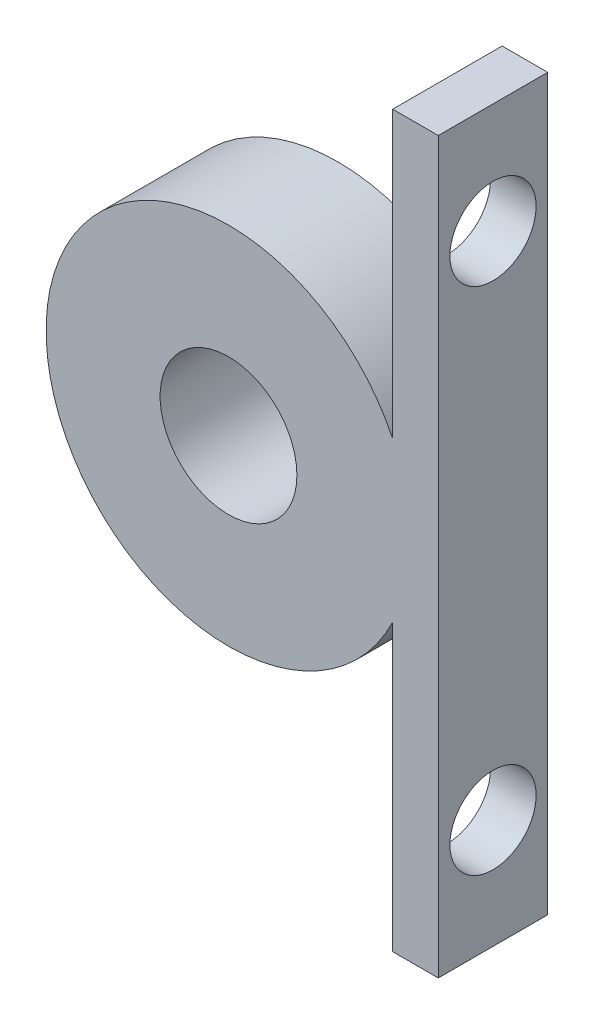
ISO-10303-21;
HEADER;
FILE_DESCRIPTION(('STEP AP214'),'2;1');
FILE_NAME('part.step','',(''),(''),'','','');
FILE_SCHEMA(('AUTOMOTIVE_DESIGN { 1 0 10303 214 1 1 1 1 }'));
ENDSEC;
DATA;
#1=APPLICATION_CONTEXT('core data for automotive mechanical design processes');
#2=APPLICATION_PROTOCOL_DEFINITION('international standard','automotive_design',2000,#1);
#3=PRODUCT_CONTEXT('',#1,'mechanical');
#4=PRODUCT('Part','Part','',(#3));
#5=PRODUCT_RELATED_PRODUCT_CATEGORY('part','',(#4));
#6=PRODUCT_DEFINITION_FORMATION('','',#4);
#7=PRODUCT_DEFINITION_CONTEXT('part definition',#1,'design');
#8=PRODUCT_DEFINITION('design','',#6,#7);
#9=PRODUCT_DEFINITION_SHAPE('','',#8);
#10=(LENGTH_UNIT() NAMED_UNIT(*) SI_UNIT(.MILLI.,.METRE.));
#11=(NAMED_UNIT(*) PLANE_ANGLE_UNIT() SI_UNIT($,.RADIAN.));
#12=(NAMED_UNIT(*) SI_UNIT($,.STERADIAN.) SOLID_ANGLE_UNIT());
#13=UNCERTAINTY_MEASURE_WITH_UNIT(LENGTH_MEASURE(1.E-05),#10,'distance_accuracy_value','');
#14=(GEOMETRIC_REPRESENTATION_CONTEXT(3) GLOBAL_UNCERTAINTY_ASSIGNED_CONTEXT((#13)) GLOBAL_UNIT_ASSIGNED_CONTEXT((#10,
#11,#12)) REPRESENTATION_CONTEXT('',''));
#15=CARTESIAN_POINT('',(0.,0.,0.));
#16=DIRECTION('',(0.,0.,1.));
#17=DIRECTION('',(1.,0.,0.));
#18=AXIS2_PLACEMENT_3D('',#15,#16,#17);
#19=CARTESIAN_POINT('',(0.,-28.0159542257824,7.62));
#20=DIRECTION('',(0.,1.,0.));
#21=DIRECTION('',(0.,0.,1.));
#22=AXIS2_PLACEMENT_3D('',#19,#20,#21);
#23=PLANE('',#22);
#24=DIRECTION('',(1.,0.,0.));
#25=VECTOR('',#24,1.);
#26=CARTESIAN_POINT('',(0.,-28.0159542257824,0.));
#27=LINE('',#26,#25);
#28=CARTESIAN_POINT('',(0.,-28.0159542257824,0.));
#29=VERTEX_POINT('',#28);
#30=CARTESIAN_POINT('',(3.175,-28.0159542257824,0.));
#31=VERTEX_POINT('',#30);
#32=EDGE_CURVE('E133',#29,#31,#27,.T.);
#33=ORIENTED_EDGE('',*,*,#32,.T.);
#34=DIRECTION('',(0.,0.,-1.));
#35=VECTOR('',#34,1.);
#36=CARTESIAN_POINT('',(3.175,-28.0159542257824,7.62));
#37=LINE('',#36,#35);
#38=CARTESIAN_POINT('',(3.175,-28.0159542257824,7.62));
#39=VERTEX_POINT('',#38);
#40=EDGE_CURVE('E11',#39,#31,#37,.T.);
#41=ORIENTED_EDGE('',*,*,#40,.F.);
#42=DIRECTION('',(1.,0.,0.));
#43=VECTOR('',#42,1.);
#44=CARTESIAN_POINT('',(0.,-28.0159542257824,7.62));
#45=LINE('',#44,#43);
#46=CARTESIAN_POINT('',(0.,-28.0159542257824,7.62));
#47=VERTEX_POINT('',#46);
#48=EDGE_CURVE('E147',#47,#39,#45,.T.);
#49=ORIENTED_EDGE('',*,*,#48,.F.);
#50=DIRECTION('',(0.,0.,-1.));
#51=VECTOR('',#50,1.);
#52=CARTESIAN_POINT('',(0.,-28.0159542257824,7.62));
#53=LINE('',#52,#51);
#54=EDGE_CURVE('E132',#47,#29,#53,.T.);
#55=ORIENTED_EDGE('',*,*,#54,.T.);
#56=EDGE_LOOP('',(#33,#41,#49,#55));
#57=FACE_BOUND('',#56,.T.);
#58=ADVANCED_FACE('F43',(#57),#23,.F.);
#59=CARTESIAN_POINT('',(3.175,0.,7.62));
#60=DIRECTION('',(-1.,0.,0.));
#61=DIRECTION('',(0.,-1.,0.));
#62=AXIS2_PLACEMENT_3D('',#59,#60,#61);
#63=PLANE('',#62);
#64=CARTESIAN_POINT('',(3.175,15.1166714258176,3.81));
#65=DIRECTION('',(-1.,0.,0.));
#66=DIRECTION('',(0.,-1.,0.));
#67=AXIS2_PLACEMENT_3D('',#64,#65,#66);
#68=CIRCLE('',#67,3.);
#69=CARTESIAN_POINT('',(3.175,12.1166714258176,3.81));
#70=VERTEX_POINT('',#69);
#71=EDGE_CURVE('E137',#70,#70,#68,.T.);
#72=ORIENTED_EDGE('',*,*,#71,.T.);
#73=EDGE_LOOP('',(#72));
#74=FACE_BOUND('',#73,.T.);
#75=CARTESIAN_POINT('',(3.175,-20.3959542257824,3.80999999999999));
#76=DIRECTION('',(-1.,0.,0.));
#77=DIRECTION('',(0.,-1.,0.));
#78=AXIS2_PLACEMENT_3D('',#75,#76,#77);
#79=CIRCLE('',#78,3.);
#80=CARTESIAN_POINT('',(3.175,-23.3959542257824,3.80999999999999));
#81=VERTEX_POINT('',#80);
#82=EDGE_CURVE('E154',#81,#81,#79,.T.);
#83=ORIENTED_EDGE('',*,*,#82,.T.);
#84=EDGE_LOOP('',(#83));
#85=FACE_BOUND('',#84,.T.);
#86=DIRECTION('',(0.,1.,0.));
#87=VECTOR('',#86,1.);
#88=CARTESIAN_POINT('',(3.175,0.,0.));
#89=LINE('',#88,#87);
#90=CARTESIAN_POINT('',(3.175,22.7840457742176,0.));
#91=VERTEX_POINT('',#90);
#92=EDGE_CURVE('E136',#31,#91,#89,.T.);
#93=ORIENTED_EDGE('',*,*,#92,.T.);
#94=DIRECTION('',(0.,0.,-1.));
#95=VECTOR('',#94,1.);
#96=CARTESIAN_POINT('',(3.175,22.7840457742176,7.62));
#97=LINE('',#96,#95);
#98=CARTESIAN_POINT('',(3.175,22.7840457742176,7.62));
#99=VERTEX_POINT('',#98);
#100=EDGE_CURVE('E52',#99,#91,#97,.T.);
#101=ORIENTED_EDGE('',*,*,#100,.F.);
#102=DIRECTION('',(0.,1.,0.));
#103=VECTOR('',#102,1.);
#104=CARTESIAN_POINT('',(3.175,0.,7.62));
#105=LINE('',#104,#103);
#106=EDGE_CURVE('E98',#39,#99,#105,.T.);
#107=ORIENTED_EDGE('',*,*,#106,.F.);
#108=ORIENTED_EDGE('',*,*,#40,.T.);
#109=EDGE_LOOP('',(#93,#101,#107,#108));
#110=FACE_BOUND('',#109,.T.);
#111=ADVANCED_FACE('F168',(#74,#85,#110),#63,.F.);
#112=CARTESIAN_POINT('',(0.,22.7840457742176,7.62));
#113=DIRECTION('',(0.,-1.,0.));
#114=DIRECTION('',(0.,0.,-1.));
#115=AXIS2_PLACEMENT_3D('',#112,#113,#114);
#116=PLANE('',#115);
#117=DIRECTION('',(-1.,0.,0.));
#118=VECTOR('',#117,1.);
#119=CARTESIAN_POINT('',(0.,22.7840457742176,0.));
#120=LINE('',#119,#118);
#121=CARTESIAN_POINT('',(0.,22.7840457742176,0.));
#122=VERTEX_POINT('',#121);
#123=EDGE_CURVE('E139',#91,#122,#120,.T.);
#124=ORIENTED_EDGE('',*,*,#123,.T.);
#125=DIRECTION('',(0.,0.,-1.));
#126=VECTOR('',#125,1.);
#127=CARTESIAN_POINT('',(0.,22.7840457742176,7.62));
#128=LINE('',#127,#126);
#129=CARTESIAN_POINT('',(0.,22.7840457742176,7.62));
#130=VERTEX_POINT('',#129);
#131=EDGE_CURVE('E121',#130,#122,#128,.T.);
#132=ORIENTED_EDGE('',*,*,#131,.F.);
#133=DIRECTION('',(-1.,0.,0.));
#134=VECTOR('',#133,1.);
#135=CARTESIAN_POINT('',(0.,22.7840457742176,7.62));
#136=LINE('',#135,#134);
#137=EDGE_CURVE('E112',#99,#130,#136,.T.);
#138=ORIENTED_EDGE('',*,*,#137,.F.);
#139=ORIENTED_EDGE('',*,*,#100,.T.);
#140=EDGE_LOOP('',(#124,#132,#138,#139));
#141=FACE_BOUND('',#140,.T.);
#142=ADVANCED_FACE('F171',(#141),#116,.F.);
#143=CARTESIAN_POINT('',(0.,0.,7.62));
#144=DIRECTION('',(1.,0.,0.));
#145=DIRECTION('',(0.,1.,0.));
#146=AXIS2_PLACEMENT_3D('',#143,#144,#145);
#147=PLANE('',#146);
#148=CARTESIAN_POINT('',(0.,15.1166714258176,3.81));
#149=DIRECTION('',(1.,0.,0.));
#150=DIRECTION('',(0.,1.,0.));
#151=AXIS2_PLACEMENT_3D('',#148,#149,#150);
#152=CIRCLE('',#151,3.);
#153=CARTESIAN_POINT('',(0.,18.1166714258176,3.81));
#154=VERTEX_POINT('',#153);
#155=EDGE_CURVE('E46',#154,#154,#152,.T.);
#156=ORIENTED_EDGE('',*,*,#155,.T.);
#157=EDGE_LOOP('',(#156));
#158=FACE_BOUND('',#157,.T.);
#159=DIRECTION('',(0.,-1.,0.));
#160=VECTOR('',#159,1.);
#161=CARTESIAN_POINT('',(0.,0.,0.));
#162=LINE('',#161,#160);
#163=CARTESIAN_POINT('',(0.,2.91984743251426,0.));
#164=VERTEX_POINT('',#163);
#165=EDGE_CURVE('E120',#122,#164,#162,.T.);
#166=ORIENTED_EDGE('',*,*,#165,.T.);
#167=DIRECTION('',(0.,0.,-1.));
#168=VECTOR('',#167,1.);
#169=CARTESIAN_POINT('',(0.,2.91984743251426,7.62));
#170=LINE('',#169,#168);
#171=CARTESIAN_POINT('',(0.,2.91984743251426,7.62));
#172=VERTEX_POINT('',#171);
#173=EDGE_CURVE('E117',#172,#164,#170,.T.);
#174=ORIENTED_EDGE('',*,*,#173,.F.);
#175=DIRECTION('',(0.,-1.,0.));
#176=VECTOR('',#175,1.);
#177=CARTESIAN_POINT('',(0.,0.,7.62));
#178=LINE('',#177,#176);
#179=EDGE_CURVE('E105',#130,#172,#178,.T.);
#180=ORIENTED_EDGE('',*,*,#179,.F.);
#181=ORIENTED_EDGE('',*,*,#131,.T.);
#182=EDGE_LOOP('',(#166,#174,#180,#181));
#183=FACE_BOUND('',#182,.T.);
#184=ADVANCED_FACE('F118',(#158,#183),#147,.F.);
#185=CARTESIAN_POINT('',(-11.43,-2.61595422578239,7.62));
#186=DIRECTION('',(0.,0.,-1.));
#187=DIRECTION('',(-1.,0.,0.));
#188=AXIS2_PLACEMENT_3D('',#185,#186,#187);
#189=CYLINDRICAL_SURFACE('',#188,12.7);
#190=CARTESIAN_POINT('',(-11.43,-2.61595422578239,0.));
#191=DIRECTION('',(0.,0.,1.));
#192=DIRECTION('',(1.,0.,0.));
#193=AXIS2_PLACEMENT_3D('',#190,#191,#192);
#194=CIRCLE('',#193,12.7);
#195=CARTESIAN_POINT('',(0.,-8.15175588407905,0.));
#196=VERTEX_POINT('',#195);
#197=EDGE_CURVE('E84',#164,#196,#194,.T.);
#198=ORIENTED_EDGE('',*,*,#197,.T.);
#199=DIRECTION('',(0.,0.,-1.));
#200=VECTOR('',#199,1.);
#201=CARTESIAN_POINT('',(0.,-8.15175588407905,7.62));
#202=LINE('',#201,#200);
#203=CARTESIAN_POINT('',(0.,-8.15175588407905,7.62));
#204=VERTEX_POINT('',#203);
#205=EDGE_CURVE('E122',#204,#196,#202,.T.);
#206=ORIENTED_EDGE('',*,*,#205,.F.);
#207=CARTESIAN_POINT('',(-11.43,-2.61595422578239,7.62));
#208=DIRECTION('',(0.,0.,1.));
#209=DIRECTION('',(1.,0.,0.));
#210=AXIS2_PLACEMENT_3D('',#207,#208,#209);
#211=CIRCLE('',#210,12.7);
#212=EDGE_CURVE('E110',#172,#204,#211,.T.);
#213=ORIENTED_EDGE('',*,*,#212,.F.);
#214=ORIENTED_EDGE('',*,*,#173,.T.);
#215=EDGE_LOOP('',(#198,#206,#213,#214));
#216=FACE_BOUND('',#215,.T.);
#217=ADVANCED_FACE('F124',(#216),#189,.T.);
#218=CARTESIAN_POINT('',(0.,0.,7.62));
#219=DIRECTION('',(1.,0.,0.));
#220=DIRECTION('',(0.,1.,0.));
#221=AXIS2_PLACEMENT_3D('',#218,#219,#220);
#222=PLANE('',#221);
#223=CARTESIAN_POINT('',(0.,-20.3959542257824,3.80999999999999));
#224=DIRECTION('',(1.,0.,0.));
#225=DIRECTION('',(0.,1.,0.));
#226=AXIS2_PLACEMENT_3D('',#223,#224,#225);
#227=CIRCLE('',#226,3.);
#228=CARTESIAN_POINT('',(0.,-17.3959542257824,3.80999999999999));
#229=VERTEX_POINT('',#228);
#230=EDGE_CURVE('E152',#229,#229,#227,.T.);
#231=ORIENTED_EDGE('',*,*,#230,.T.);
#232=EDGE_LOOP('',(#231));
#233=FACE_BOUND('',#232,.T.);
#234=DIRECTION('',(0.,-1.,0.));
#235=VECTOR('',#234,1.);
#236=CARTESIAN_POINT('',(0.,0.,0.));
#237=LINE('',#236,#235);
#238=EDGE_CURVE('E90',#196,#29,#237,.T.);
#239=ORIENTED_EDGE('',*,*,#238,.T.);
#240=ORIENTED_EDGE('',*,*,#54,.F.);
#241=DIRECTION('',(0.,-1.,0.));
#242=VECTOR('',#241,1.);
#243=CARTESIAN_POINT('',(0.,0.,7.62));
#244=LINE('',#243,#242);
#245=EDGE_CURVE('E61',#204,#47,#244,.T.);
#246=ORIENTED_EDGE('',*,*,#245,.F.);
#247=ORIENTED_EDGE('',*,*,#205,.T.);
#248=EDGE_LOOP('',(#239,#240,#246,#247));
#249=FACE_BOUND('',#248,.T.);
#250=ADVANCED_FACE('F177',(#233,#249),#222,.F.);
#251=CARTESIAN_POINT('',(-11.43,-2.61595422578239,7.62));
#252=DIRECTION('',(0.,0.,-1.));
#253=DIRECTION('',(-1.,0.,0.));
#254=AXIS2_PLACEMENT_3D('',#251,#252,#253);
#255=CYLINDRICAL_SURFACE('',#254,4.7625);
#256=CARTESIAN_POINT('',(-11.43,-2.61595422578239,7.62));
#257=DIRECTION('',(0.,0.,1.));
#258=DIRECTION('',(1.,0.,0.));
#259=AXIS2_PLACEMENT_3D('',#256,#257,#258);
#260=CIRCLE('',#259,4.7625);
#261=CARTESIAN_POINT('',(-6.6675,-2.61595422578239,7.62));
#262=VERTEX_POINT('',#261);
#263=EDGE_CURVE('E126',#262,#262,#260,.T.);
#264=ORIENTED_EDGE('',*,*,#263,.T.);
#265=EDGE_LOOP('',(#264));
#266=FACE_BOUND('',#265,.T.);
#267=CARTESIAN_POINT('',(-11.43,-2.61595422578239,0.));
#268=DIRECTION('',(0.,0.,1.));
#269=DIRECTION('',(1.,0.,0.));
#270=AXIS2_PLACEMENT_3D('',#267,#268,#269);
#271=CIRCLE('',#270,4.7625);
#272=CARTESIAN_POINT('',(-6.6675,-2.61595422578239,0.));
#273=VERTEX_POINT('',#272);
#274=EDGE_CURVE('E144',#273,#273,#271,.T.);
#275=ORIENTED_EDGE('',*,*,#274,.F.);
#276=EDGE_LOOP('',(#275));
#277=FACE_BOUND('',#276,.T.);
#278=ADVANCED_FACE('F179',(#266,#277),#255,.F.);
#279=CARTESIAN_POINT('',(0.,0.,7.62));
#280=DIRECTION('',(0.,0.,1.));
#281=DIRECTION('',(1.,0.,0.));
#282=AXIS2_PLACEMENT_3D('',#279,#280,#281);
#283=PLANE('',#282);
#284=ORIENTED_EDGE('',*,*,#48,.T.);
#285=ORIENTED_EDGE('',*,*,#106,.T.);
#286=ORIENTED_EDGE('',*,*,#137,.T.);
#287=ORIENTED_EDGE('',*,*,#179,.T.);
#288=ORIENTED_EDGE('',*,*,#212,.T.);
#289=ORIENTED_EDGE('',*,*,#245,.T.);
#290=EDGE_LOOP('',(#284,#285,#286,#287,#288,#289));
#291=FACE_BOUND('',#290,.T.);
#292=ORIENTED_EDGE('',*,*,#263,.F.);
#293=EDGE_LOOP('',(#292));
#294=FACE_BOUND('',#293,.T.);
#295=ADVANCED_FACE('F107',(#291,#294),#283,.T.);
#296=CARTESIAN_POINT('',(0.,0.,0.));
#297=DIRECTION('',(0.,0.,1.));
#298=DIRECTION('',(1.,0.,0.));
#299=AXIS2_PLACEMENT_3D('',#296,#297,#298);
#300=PLANE('',#299);
#301=ORIENTED_EDGE('',*,*,#32,.F.);
#302=ORIENTED_EDGE('',*,*,#238,.F.);
#303=ORIENTED_EDGE('',*,*,#197,.F.);
#304=ORIENTED_EDGE('',*,*,#165,.F.);
#305=ORIENTED_EDGE('',*,*,#123,.F.);
#306=ORIENTED_EDGE('',*,*,#92,.F.);
#307=EDGE_LOOP('',(#301,#302,#303,#304,#305,#306));
#308=FACE_BOUND('',#307,.T.);
#309=ORIENTED_EDGE('',*,*,#274,.T.);
#310=EDGE_LOOP('',(#309));
#311=FACE_BOUND('',#310,.T.);
#312=ADVANCED_FACE('F174',(#308,#311),#300,.F.);
#313=CARTESIAN_POINT('',(-1.905,-20.3959542257824,3.80999999999999));
#314=DIRECTION('',(1.,0.,0.));
#315=DIRECTION('',(0.,1.,0.));
#316=AXIS2_PLACEMENT_3D('',#313,#314,#315);
#317=CYLINDRICAL_SURFACE('',#316,3.);
#318=ORIENTED_EDGE('',*,*,#230,.F.);
#319=EDGE_LOOP('',(#318));
#320=FACE_BOUND('',#319,.T.);
#321=ORIENTED_EDGE('',*,*,#82,.F.);
#322=EDGE_LOOP('',(#321));
#323=FACE_BOUND('',#322,.T.);
#324=ADVANCED_FACE('F209',(#320,#323),#317,.F.);
#325=CARTESIAN_POINT('',(-1.905,15.1166714258176,3.81));
#326=DIRECTION('',(1.,0.,0.));
#327=DIRECTION('',(0.,1.,0.));
#328=AXIS2_PLACEMENT_3D('',#325,#326,#327);
#329=CYLINDRICAL_SURFACE('',#328,3.);
#330=ORIENTED_EDGE('',*,*,#155,.F.);
#331=EDGE_LOOP('',(#330));
#332=FACE_BOUND('',#331,.T.);
#333=ORIENTED_EDGE('',*,*,#71,.F.);
#334=EDGE_LOOP('',(#333));
#335=FACE_BOUND('',#334,.T.);
#336=ADVANCED_FACE('F206',(#332,#335),#329,.F.);
#337=CLOSED_SHELL('',(#58,#111,#142,#184,#217,#250,#278,#295,#312,#324,#336));
#338=MANIFOLD_SOLID_BREP('B2',#337);
#339=ADVANCED_BREP_SHAPE_REPRESENTATION('',(#18,#338),#14);
#340=SHAPE_DEFINITION_REPRESENTATION(#9,#339);
ENDSEC;
END-ISO-10303-21;
